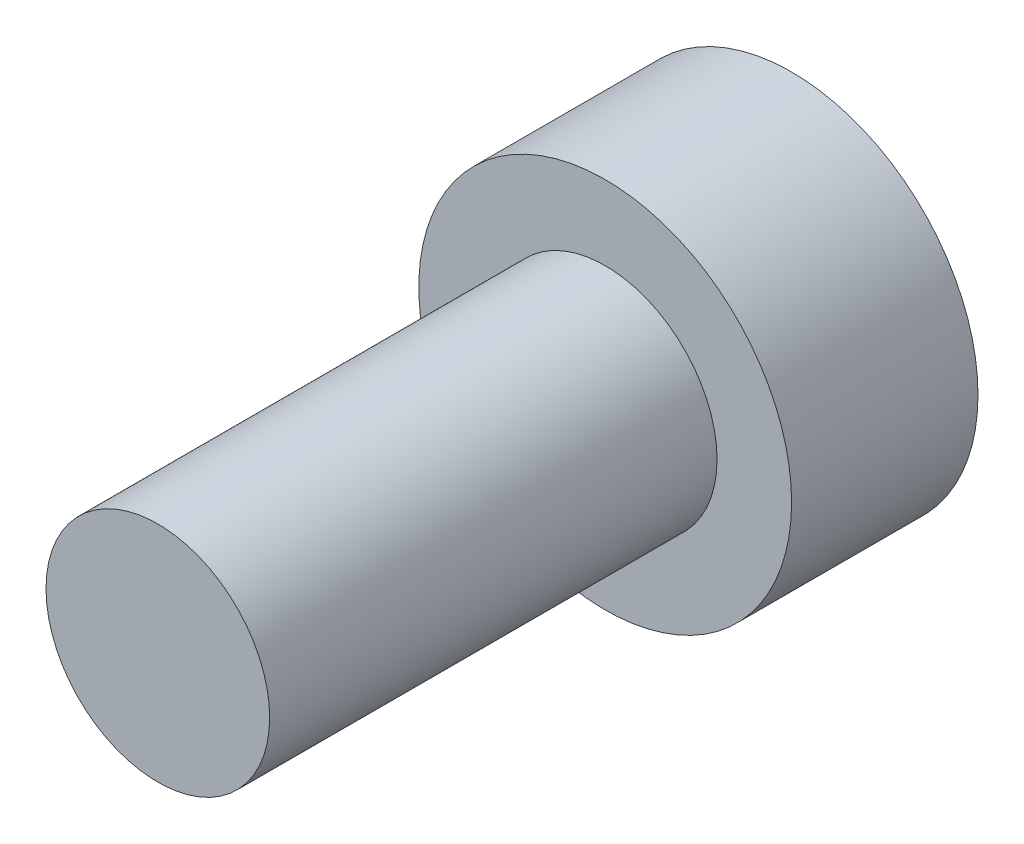
ISO-10303-21;
HEADER;
FILE_DESCRIPTION(('STEP AP214'),'2;1');
FILE_NAME('part.step','',(''),(''),'','','');
FILE_SCHEMA(('AUTOMOTIVE_DESIGN { 1 0 10303 214 1 1 1 1 }'));
ENDSEC;
DATA;
#1=APPLICATION_CONTEXT('core data for automotive mechanical design processes');
#2=APPLICATION_PROTOCOL_DEFINITION('international standard','automotive_design',2000,#1);
#3=PRODUCT_CONTEXT('',#1,'mechanical');
#4=PRODUCT('Part','Part','',(#3));
#5=PRODUCT_RELATED_PRODUCT_CATEGORY('part','',(#4));
#6=PRODUCT_DEFINITION_FORMATION('','',#4);
#7=PRODUCT_DEFINITION_CONTEXT('part definition',#1,'design');
#8=PRODUCT_DEFINITION('design','',#6,#7);
#9=PRODUCT_DEFINITION_SHAPE('','',#8);
#10=(LENGTH_UNIT() NAMED_UNIT(*) SI_UNIT(.MILLI.,.METRE.));
#11=(NAMED_UNIT(*) PLANE_ANGLE_UNIT() SI_UNIT($,.RADIAN.));
#12=(NAMED_UNIT(*) SI_UNIT($,.STERADIAN.) SOLID_ANGLE_UNIT());
#13=UNCERTAINTY_MEASURE_WITH_UNIT(LENGTH_MEASURE(1.E-05),#10,'distance_accuracy_value','');
#14=(GEOMETRIC_REPRESENTATION_CONTEXT(3) GLOBAL_UNCERTAINTY_ASSIGNED_CONTEXT((#13)) GLOBAL_UNIT_ASSIGNED_CONTEXT((#10,
#11,#12)) REPRESENTATION_CONTEXT('',''));
#15=CARTESIAN_POINT('',(0.,0.,0.));
#16=DIRECTION('',(0.,0.,1.));
#17=DIRECTION('',(1.,0.,0.));
#18=AXIS2_PLACEMENT_3D('',#15,#16,#17);
#19=CARTESIAN_POINT('',(0.,0.,0.));
#20=DIRECTION('',(0.,0.,1.));
#21=DIRECTION('',(1.,0.,0.));
#22=AXIS2_PLACEMENT_3D('',#19,#20,#21);
#23=PLANE('',#22);
#24=CARTESIAN_POINT('',(0.,0.,0.));
#25=DIRECTION('',(0.,0.,1.));
#26=DIRECTION('',(1.,0.,0.));
#27=AXIS2_PLACEMENT_3D('',#24,#25,#26);
#28=CIRCLE('',#27,2.5);
#29=CARTESIAN_POINT('',(2.5,0.,0.));
#30=VERTEX_POINT('',#29);
#31=EDGE_CURVE('E41',#30,#30,#28,.T.);
#32=ORIENTED_EDGE('',*,*,#31,.T.);
#33=EDGE_LOOP('',(#32));
#34=FACE_BOUND('',#33,.T.);
#35=CARTESIAN_POINT('',(0.,0.,0.));
#36=DIRECTION('',(0.,0.,1.));
#37=DIRECTION('',(1.,0.,0.));
#38=AXIS2_PLACEMENT_3D('',#35,#36,#37);
#39=CIRCLE('',#38,1.5);
#40=CARTESIAN_POINT('',(1.5,0.,0.));
#41=VERTEX_POINT('',#40);
#42=EDGE_CURVE('E50',#41,#41,#39,.T.);
#43=ORIENTED_EDGE('',*,*,#42,.F.);
#44=EDGE_LOOP('',(#43));
#45=FACE_BOUND('',#44,.T.);
#46=ADVANCED_FACE('F37',(#34,#45),#23,.T.);
#47=CARTESIAN_POINT('',(0.,0.,-2.5));
#48=DIRECTION('',(0.,0.,1.));
#49=DIRECTION('',(1.,0.,0.));
#50=AXIS2_PLACEMENT_3D('',#47,#48,#49);
#51=CYLINDRICAL_SURFACE('',#50,2.5);
#52=CARTESIAN_POINT('',(0.,0.,-2.5));
#53=DIRECTION('',(0.,0.,1.));
#54=DIRECTION('',(1.,0.,0.));
#55=AXIS2_PLACEMENT_3D('',#52,#53,#54);
#56=CIRCLE('',#55,2.5);
#57=CARTESIAN_POINT('',(2.5,0.,-2.5));
#58=VERTEX_POINT('',#57);
#59=EDGE_CURVE('E10',#58,#58,#56,.T.);
#60=ORIENTED_EDGE('',*,*,#59,.T.);
#61=EDGE_LOOP('',(#60));
#62=FACE_BOUND('',#61,.T.);
#63=ORIENTED_EDGE('',*,*,#31,.F.);
#64=EDGE_LOOP('',(#63));
#65=FACE_BOUND('',#64,.T.);
#66=ADVANCED_FACE('F39',(#62,#65),#51,.T.);
#67=CARTESIAN_POINT('',(0.,0.,-2.5));
#68=DIRECTION('',(0.,0.,1.));
#69=DIRECTION('',(1.,0.,0.));
#70=AXIS2_PLACEMENT_3D('',#67,#68,#69);
#71=PLANE('',#70);
#72=ORIENTED_EDGE('',*,*,#59,.F.);
#73=EDGE_LOOP('',(#72));
#74=FACE_BOUND('',#73,.T.);
#75=ADVANCED_FACE('F61',(#74),#71,.F.);
#76=CARTESIAN_POINT('',(0.,0.,6.));
#77=DIRECTION('',(0.,0.,-1.));
#78=DIRECTION('',(-1.,0.,0.));
#79=AXIS2_PLACEMENT_3D('',#76,#77,#78);
#80=CYLINDRICAL_SURFACE('',#79,1.5);
#81=CARTESIAN_POINT('',(0.,0.,6.));
#82=DIRECTION('',(0.,0.,1.));
#83=DIRECTION('',(1.,0.,0.));
#84=AXIS2_PLACEMENT_3D('',#81,#82,#83);
#85=CIRCLE('',#84,1.5);
#86=CARTESIAN_POINT('',(1.5,0.,6.));
#87=VERTEX_POINT('',#86);
#88=EDGE_CURVE('E48',#87,#87,#85,.T.);
#89=ORIENTED_EDGE('',*,*,#88,.F.);
#90=EDGE_LOOP('',(#89));
#91=FACE_BOUND('',#90,.T.);
#92=ORIENTED_EDGE('',*,*,#42,.T.);
#93=EDGE_LOOP('',(#92));
#94=FACE_BOUND('',#93,.T.);
#95=ADVANCED_FACE('F58',(#91,#94),#80,.T.);
#96=CARTESIAN_POINT('',(0.,0.,6.));
#97=DIRECTION('',(0.,0.,1.));
#98=DIRECTION('',(1.,0.,0.));
#99=AXIS2_PLACEMENT_3D('',#96,#97,#98);
#100=PLANE('',#99);
#101=ORIENTED_EDGE('',*,*,#88,.T.);
#102=EDGE_LOOP('',(#101));
#103=FACE_BOUND('',#102,.T.);
#104=ADVANCED_FACE('F56',(#103),#100,.T.);
#105=CLOSED_SHELL('',(#46,#66,#75,#95,#104));
#106=MANIFOLD_SOLID_BREP('B2',#105);
#107=ADVANCED_BREP_SHAPE_REPRESENTATION('',(#18,#106),#14);
#108=SHAPE_DEFINITION_REPRESENTATION(#9,#107);
ENDSEC;
END-ISO-10303-21;
